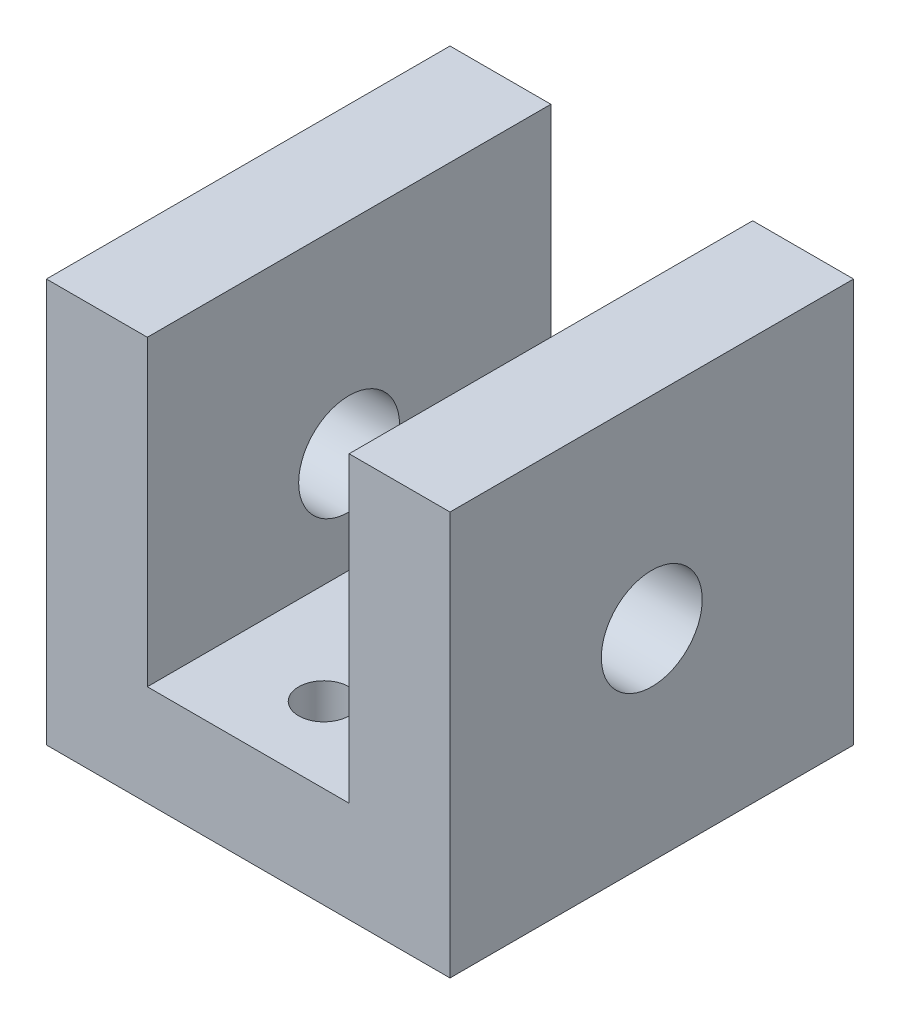
ISO-10303-21;
HEADER;
FILE_DESCRIPTION(('STEP AP214'),'2;1');
FILE_NAME('part.step','',(''),(''),'','','');
FILE_SCHEMA(('AUTOMOTIVE_DESIGN { 1 0 10303 214 1 1 1 1 }'));
ENDSEC;
DATA;
#1=APPLICATION_CONTEXT('core data for automotive mechanical design processes');
#2=APPLICATION_PROTOCOL_DEFINITION('international standard','automotive_design',2000,#1);
#3=PRODUCT_CONTEXT('',#1,'mechanical');
#4=PRODUCT('Part','Part','',(#3));
#5=PRODUCT_RELATED_PRODUCT_CATEGORY('part','',(#4));
#6=PRODUCT_DEFINITION_FORMATION('','',#4);
#7=PRODUCT_DEFINITION_CONTEXT('part definition',#1,'design');
#8=PRODUCT_DEFINITION('design','',#6,#7);
#9=PRODUCT_DEFINITION_SHAPE('','',#8);
#10=(LENGTH_UNIT() NAMED_UNIT(*) SI_UNIT(.MILLI.,.METRE.));
#11=(NAMED_UNIT(*) PLANE_ANGLE_UNIT() SI_UNIT($,.RADIAN.));
#12=(NAMED_UNIT(*) SI_UNIT($,.STERADIAN.) SOLID_ANGLE_UNIT());
#13=UNCERTAINTY_MEASURE_WITH_UNIT(LENGTH_MEASURE(1.E-05),#10,'distance_accuracy_value','');
#14=(GEOMETRIC_REPRESENTATION_CONTEXT(3) GLOBAL_UNCERTAINTY_ASSIGNED_CONTEXT((#13)) GLOBAL_UNIT_ASSIGNED_CONTEXT((#10,
#11,#12)) REPRESENTATION_CONTEXT('',''));
#15=CARTESIAN_POINT('',(0.,0.,0.));
#16=DIRECTION('',(0.,0.,1.));
#17=DIRECTION('',(1.,0.,0.));
#18=AXIS2_PLACEMENT_3D('',#15,#16,#17);
#19=CARTESIAN_POINT('',(50.8,0.,50.8));
#20=DIRECTION('',(0.,1.,0.));
#21=DIRECTION('',(-1.,0.,0.));
#22=AXIS2_PLACEMENT_3D('',#19,#20,#21);
#23=PLANE('',#22);
#24=CARTESIAN_POINT('',(25.4,0.,9.525));
#25=DIRECTION('',(0.,-1.,0.));
#26=DIRECTION('',(1.,0.,0.));
#27=AXIS2_PLACEMENT_3D('',#24,#25,#26);
#28=CIRCLE('',#27,3.175);
#29=CARTESIAN_POINT('',(28.575,0.,9.525));
#30=VERTEX_POINT('',#29);
#31=EDGE_CURVE('E166',#30,#30,#28,.T.);
#32=ORIENTED_EDGE('',*,*,#31,.F.);
#33=EDGE_LOOP('',(#32));
#34=FACE_BOUND('',#33,.T.);
#35=CARTESIAN_POINT('',(25.4,0.,41.275));
#36=DIRECTION('',(0.,-1.,0.));
#37=DIRECTION('',(1.,0.,0.));
#38=AXIS2_PLACEMENT_3D('',#35,#36,#37);
#39=CIRCLE('',#38,3.175);
#40=CARTESIAN_POINT('',(28.575,0.,41.275));
#41=VERTEX_POINT('',#40);
#42=EDGE_CURVE('E158',#41,#41,#39,.T.);
#43=ORIENTED_EDGE('',*,*,#42,.F.);
#44=EDGE_LOOP('',(#43));
#45=FACE_BOUND('',#44,.T.);
#46=DIRECTION('',(1.,0.,0.));
#47=VECTOR('',#46,1.);
#48=CARTESIAN_POINT('',(50.8,0.,0.));
#49=LINE('',#48,#47);
#50=CARTESIAN_POINT('',(0.,0.,0.));
#51=VERTEX_POINT('',#50);
#52=CARTESIAN_POINT('',(50.8,0.,0.));
#53=VERTEX_POINT('',#52);
#54=EDGE_CURVE('E131',#51,#53,#49,.T.);
#55=ORIENTED_EDGE('',*,*,#54,.T.);
#56=DIRECTION('',(0.,0.,-1.));
#57=VECTOR('',#56,1.);
#58=CARTESIAN_POINT('',(50.8,0.,50.8));
#59=LINE('',#58,#57);
#60=CARTESIAN_POINT('',(50.8,0.,50.8));
#61=VERTEX_POINT('',#60);
#62=EDGE_CURVE('E11',#61,#53,#59,.T.);
#63=ORIENTED_EDGE('',*,*,#62,.F.);
#64=DIRECTION('',(1.,0.,0.));
#65=VECTOR('',#64,1.);
#66=CARTESIAN_POINT('',(50.8,0.,50.8));
#67=LINE('',#66,#65);
#68=CARTESIAN_POINT('',(0.,0.,50.8));
#69=VERTEX_POINT('',#68);
#70=EDGE_CURVE('E146',#69,#61,#67,.T.);
#71=ORIENTED_EDGE('',*,*,#70,.F.);
#72=DIRECTION('',(0.,0.,-1.));
#73=VECTOR('',#72,1.);
#74=CARTESIAN_POINT('',(0.,0.,50.8));
#75=LINE('',#74,#73);
#76=EDGE_CURVE('E127',#69,#51,#75,.T.);
#77=ORIENTED_EDGE('',*,*,#76,.T.);
#78=EDGE_LOOP('',(#55,#63,#71,#77));
#79=FACE_BOUND('',#78,.T.);
#80=ADVANCED_FACE('F33',(#34,#45,#79),#23,.F.);
#81=CARTESIAN_POINT('',(50.8,50.8,50.8));
#82=DIRECTION('',(-1.,0.,0.));
#83=DIRECTION('',(0.,-1.,0.));
#84=AXIS2_PLACEMENT_3D('',#81,#82,#83);
#85=PLANE('',#84);
#86=CARTESIAN_POINT('',(50.8,25.4,25.4));
#87=DIRECTION('',(1.,0.,0.));
#88=DIRECTION('',(0.,1.,0.));
#89=AXIS2_PLACEMENT_3D('',#86,#87,#88);
#90=CIRCLE('',#89,6.35);
#91=CARTESIAN_POINT('',(50.8,31.75,25.4));
#92=VERTEX_POINT('',#91);
#93=EDGE_CURVE('E225',#92,#92,#90,.T.);
#94=ORIENTED_EDGE('',*,*,#93,.F.);
#95=EDGE_LOOP('',(#94));
#96=FACE_BOUND('',#95,.T.);
#97=DIRECTION('',(0.,1.,0.));
#98=VECTOR('',#97,1.);
#99=CARTESIAN_POINT('',(50.8,50.8,0.));
#100=LINE('',#99,#98);
#101=CARTESIAN_POINT('',(50.8,50.8,0.));
#102=VERTEX_POINT('',#101);
#103=EDGE_CURVE('E134',#53,#102,#100,.T.);
#104=ORIENTED_EDGE('',*,*,#103,.T.);
#105=DIRECTION('',(0.,0.,-1.));
#106=VECTOR('',#105,1.);
#107=CARTESIAN_POINT('',(50.8,50.8,50.8));
#108=LINE('',#107,#106);
#109=CARTESIAN_POINT('',(50.8,50.8,50.8));
#110=VERTEX_POINT('',#109);
#111=EDGE_CURVE('E42',#110,#102,#108,.T.);
#112=ORIENTED_EDGE('',*,*,#111,.F.);
#113=DIRECTION('',(0.,1.,0.));
#114=VECTOR('',#113,1.);
#115=CARTESIAN_POINT('',(50.8,50.8,50.8));
#116=LINE('',#115,#114);
#117=EDGE_CURVE('E94',#61,#110,#116,.T.);
#118=ORIENTED_EDGE('',*,*,#117,.F.);
#119=ORIENTED_EDGE('',*,*,#62,.T.);
#120=EDGE_LOOP('',(#104,#112,#118,#119));
#121=FACE_BOUND('',#120,.T.);
#122=ADVANCED_FACE('F205',(#96,#121),#85,.F.);
#123=CARTESIAN_POINT('',(38.1,50.8,50.8));
#124=DIRECTION('',(0.,-1.,0.));
#125=DIRECTION('',(0.,0.,-1.));
#126=AXIS2_PLACEMENT_3D('',#123,#124,#125);
#127=PLANE('',#126);
#128=DIRECTION('',(-1.,0.,0.));
#129=VECTOR('',#128,1.);
#130=CARTESIAN_POINT('',(38.1,50.8,0.));
#131=LINE('',#130,#129);
#132=CARTESIAN_POINT('',(38.1,50.8,0.));
#133=VERTEX_POINT('',#132);
#134=EDGE_CURVE('E137',#102,#133,#131,.T.);
#135=ORIENTED_EDGE('',*,*,#134,.T.);
#136=DIRECTION('',(0.,0.,-1.));
#137=VECTOR('',#136,1.);
#138=CARTESIAN_POINT('',(38.1,50.8,50.8));
#139=LINE('',#138,#137);
#140=CARTESIAN_POINT('',(38.1,50.8,50.8));
#141=VERTEX_POINT('',#140);
#142=EDGE_CURVE('E153',#141,#133,#139,.T.);
#143=ORIENTED_EDGE('',*,*,#142,.F.);
#144=DIRECTION('',(-1.,0.,0.));
#145=VECTOR('',#144,1.);
#146=CARTESIAN_POINT('',(38.1,50.8,50.8));
#147=LINE('',#146,#145);
#148=EDGE_CURVE('E172',#110,#141,#147,.T.);
#149=ORIENTED_EDGE('',*,*,#148,.F.);
#150=ORIENTED_EDGE('',*,*,#111,.T.);
#151=EDGE_LOOP('',(#135,#143,#149,#150));
#152=FACE_BOUND('',#151,.T.);
#153=ADVANCED_FACE('F210',(#152),#127,.F.);
#154=CARTESIAN_POINT('',(38.1,12.7,50.8));
#155=DIRECTION('',(1.,0.,0.));
#156=DIRECTION('',(0.,0.,-1.));
#157=AXIS2_PLACEMENT_3D('',#154,#155,#156);
#158=PLANE('',#157);
#159=CARTESIAN_POINT('',(38.1,25.4,25.4));
#160=DIRECTION('',(1.,0.,0.));
#161=DIRECTION('',(0.,0.,-1.));
#162=AXIS2_PLACEMENT_3D('',#159,#160,#161);
#163=CIRCLE('',#162,6.35);
#164=CARTESIAN_POINT('',(38.1,25.4,19.05));
#165=VERTEX_POINT('',#164);
#166=EDGE_CURVE('E216',#165,#165,#163,.T.);
#167=ORIENTED_EDGE('',*,*,#166,.T.);
#168=EDGE_LOOP('',(#167));
#169=FACE_BOUND('',#168,.T.);
#170=DIRECTION('',(0.,-1.,0.));
#171=VECTOR('',#170,1.);
#172=CARTESIAN_POINT('',(38.1,12.7,0.));
#173=LINE('',#172,#171);
#174=CARTESIAN_POINT('',(38.1,12.7,0.));
#175=VERTEX_POINT('',#174);
#176=EDGE_CURVE('E139',#133,#175,#173,.T.);
#177=ORIENTED_EDGE('',*,*,#176,.T.);
#178=DIRECTION('',(0.,0.,-1.));
#179=VECTOR('',#178,1.);
#180=CARTESIAN_POINT('',(38.1,12.7,50.8));
#181=LINE('',#180,#179);
#182=CARTESIAN_POINT('',(38.1,12.7,50.8));
#183=VERTEX_POINT('',#182);
#184=EDGE_CURVE('E150',#183,#175,#181,.T.);
#185=ORIENTED_EDGE('',*,*,#184,.F.);
#186=DIRECTION('',(0.,-1.,0.));
#187=VECTOR('',#186,1.);
#188=CARTESIAN_POINT('',(38.1,12.7,50.8));
#189=LINE('',#188,#187);
#190=EDGE_CURVE('E174',#141,#183,#189,.T.);
#191=ORIENTED_EDGE('',*,*,#190,.F.);
#192=ORIENTED_EDGE('',*,*,#142,.T.);
#193=EDGE_LOOP('',(#177,#185,#191,#192));
#194=FACE_BOUND('',#193,.T.);
#195=ADVANCED_FACE('F180',(#169,#194),#158,.F.);
#196=CARTESIAN_POINT('',(12.7,12.7,50.8));
#197=DIRECTION('',(0.,-1.,0.));
#198=DIRECTION('',(1.,0.,0.));
#199=AXIS2_PLACEMENT_3D('',#196,#197,#198);
#200=PLANE('',#199);
#201=CARTESIAN_POINT('',(25.4,12.7,9.525));
#202=DIRECTION('',(0.,-1.,0.));
#203=DIRECTION('',(1.,0.,0.));
#204=AXIS2_PLACEMENT_3D('',#201,#202,#203);
#205=CIRCLE('',#204,3.175);
#206=CARTESIAN_POINT('',(28.575,12.7,9.525));
#207=VERTEX_POINT('',#206);
#208=EDGE_CURVE('E36',#207,#207,#205,.T.);
#209=ORIENTED_EDGE('',*,*,#208,.T.);
#210=EDGE_LOOP('',(#209));
#211=FACE_BOUND('',#210,.T.);
#212=CARTESIAN_POINT('',(25.4,12.7,41.275));
#213=DIRECTION('',(0.,-1.,0.));
#214=DIRECTION('',(1.,0.,0.));
#215=AXIS2_PLACEMENT_3D('',#212,#213,#214);
#216=CIRCLE('',#215,3.175);
#217=CARTESIAN_POINT('',(28.575,12.7,41.275));
#218=VERTEX_POINT('',#217);
#219=EDGE_CURVE('E135',#218,#218,#216,.T.);
#220=ORIENTED_EDGE('',*,*,#219,.T.);
#221=EDGE_LOOP('',(#220));
#222=FACE_BOUND('',#221,.T.);
#223=DIRECTION('',(-1.,0.,0.));
#224=VECTOR('',#223,1.);
#225=CARTESIAN_POINT('',(12.7,12.7,0.));
#226=LINE('',#225,#224);
#227=CARTESIAN_POINT('',(12.7,12.7,0.));
#228=VERTEX_POINT('',#227);
#229=EDGE_CURVE('E141',#175,#228,#226,.T.);
#230=ORIENTED_EDGE('',*,*,#229,.T.);
#231=DIRECTION('',(0.,0.,-1.));
#232=VECTOR('',#231,1.);
#233=CARTESIAN_POINT('',(12.7,12.7,50.8));
#234=LINE('',#233,#232);
#235=CARTESIAN_POINT('',(12.7,12.7,50.8));
#236=VERTEX_POINT('',#235);
#237=EDGE_CURVE('E122',#236,#228,#234,.T.);
#238=ORIENTED_EDGE('',*,*,#237,.F.);
#239=DIRECTION('',(-1.,0.,0.));
#240=VECTOR('',#239,1.);
#241=CARTESIAN_POINT('',(12.7,12.7,50.8));
#242=LINE('',#241,#240);
#243=EDGE_CURVE('E113',#183,#236,#242,.T.);
#244=ORIENTED_EDGE('',*,*,#243,.F.);
#245=ORIENTED_EDGE('',*,*,#184,.T.);
#246=EDGE_LOOP('',(#230,#238,#244,#245));
#247=FACE_BOUND('',#246,.T.);
#248=ADVANCED_FACE('F184',(#211,#222,#247),#200,.F.);
#249=CARTESIAN_POINT('',(12.7,50.8,50.8));
#250=DIRECTION('',(-1.,0.,0.));
#251=DIRECTION('',(0.,-1.,0.));
#252=AXIS2_PLACEMENT_3D('',#249,#250,#251);
#253=PLANE('',#252);
#254=CARTESIAN_POINT('',(12.7,25.4,25.4));
#255=DIRECTION('',(-1.,0.,0.));
#256=DIRECTION('',(0.,-1.,0.));
#257=AXIS2_PLACEMENT_3D('',#254,#255,#256);
#258=CIRCLE('',#257,6.35);
#259=CARTESIAN_POINT('',(12.7,19.05,25.4));
#260=VERTEX_POINT('',#259);
#261=EDGE_CURVE('E218',#260,#260,#258,.T.);
#262=ORIENTED_EDGE('',*,*,#261,.T.);
#263=EDGE_LOOP('',(#262));
#264=FACE_BOUND('',#263,.T.);
#265=DIRECTION('',(0.,1.,0.));
#266=VECTOR('',#265,1.);
#267=CARTESIAN_POINT('',(12.7,50.8,0.));
#268=LINE('',#267,#266);
#269=CARTESIAN_POINT('',(12.7,50.8,0.));
#270=VERTEX_POINT('',#269);
#271=EDGE_CURVE('E121',#228,#270,#268,.T.);
#272=ORIENTED_EDGE('',*,*,#271,.T.);
#273=DIRECTION('',(0.,0.,-1.));
#274=VECTOR('',#273,1.);
#275=CARTESIAN_POINT('',(12.7,50.8,50.8));
#276=LINE('',#275,#274);
#277=CARTESIAN_POINT('',(12.7,50.8,50.8));
#278=VERTEX_POINT('',#277);
#279=EDGE_CURVE('E118',#278,#270,#276,.T.);
#280=ORIENTED_EDGE('',*,*,#279,.F.);
#281=DIRECTION('',(0.,1.,0.));
#282=VECTOR('',#281,1.);
#283=CARTESIAN_POINT('',(12.7,50.8,50.8));
#284=LINE('',#283,#282);
#285=EDGE_CURVE('E107',#236,#278,#284,.T.);
#286=ORIENTED_EDGE('',*,*,#285,.F.);
#287=ORIENTED_EDGE('',*,*,#237,.T.);
#288=EDGE_LOOP('',(#272,#280,#286,#287));
#289=FACE_BOUND('',#288,.T.);
#290=ADVANCED_FACE('F119',(#264,#289),#253,.F.);
#291=CARTESIAN_POINT('',(0.,50.8,50.8));
#292=DIRECTION('',(0.,-1.,0.));
#293=DIRECTION('',(0.,0.,-1.));
#294=AXIS2_PLACEMENT_3D('',#291,#292,#293);
#295=PLANE('',#294);
#296=DIRECTION('',(-1.,0.,0.));
#297=VECTOR('',#296,1.);
#298=CARTESIAN_POINT('',(0.,50.8,0.));
#299=LINE('',#298,#297);
#300=CARTESIAN_POINT('',(0.,50.8,0.));
#301=VERTEX_POINT('',#300);
#302=EDGE_CURVE('E80',#270,#301,#299,.T.);
#303=ORIENTED_EDGE('',*,*,#302,.T.);
#304=DIRECTION('',(0.,0.,-1.));
#305=VECTOR('',#304,1.);
#306=CARTESIAN_POINT('',(0.,50.8,50.8));
#307=LINE('',#306,#305);
#308=CARTESIAN_POINT('',(0.,50.8,50.8));
#309=VERTEX_POINT('',#308);
#310=EDGE_CURVE('E123',#309,#301,#307,.T.);
#311=ORIENTED_EDGE('',*,*,#310,.F.);
#312=DIRECTION('',(-1.,0.,0.));
#313=VECTOR('',#312,1.);
#314=CARTESIAN_POINT('',(0.,50.8,50.8));
#315=LINE('',#314,#313);
#316=EDGE_CURVE('E111',#278,#309,#315,.T.);
#317=ORIENTED_EDGE('',*,*,#316,.F.);
#318=ORIENTED_EDGE('',*,*,#279,.T.);
#319=EDGE_LOOP('',(#303,#311,#317,#318));
#320=FACE_BOUND('',#319,.T.);
#321=ADVANCED_FACE('F125',(#320),#295,.F.);
#322=CARTESIAN_POINT('',(0.,0.,50.8));
#323=DIRECTION('',(1.,0.,0.));
#324=DIRECTION('',(0.,0.,-1.));
#325=AXIS2_PLACEMENT_3D('',#322,#323,#324);
#326=PLANE('',#325);
#327=CARTESIAN_POINT('',(0.,25.4,25.4));
#328=DIRECTION('',(1.,0.,0.));
#329=DIRECTION('',(0.,1.,0.));
#330=AXIS2_PLACEMENT_3D('',#327,#328,#329);
#331=CIRCLE('',#330,6.35);
#332=CARTESIAN_POINT('',(0.,31.75,25.4));
#333=VERTEX_POINT('',#332);
#334=EDGE_CURVE('E222',#333,#333,#331,.T.);
#335=ORIENTED_EDGE('',*,*,#334,.T.);
#336=EDGE_LOOP('',(#335));
#337=FACE_BOUND('',#336,.T.);
#338=DIRECTION('',(0.,-1.,0.));
#339=VECTOR('',#338,1.);
#340=CARTESIAN_POINT('',(0.,0.,0.));
#341=LINE('',#340,#339);
#342=EDGE_CURVE('E86',#301,#51,#341,.T.);
#343=ORIENTED_EDGE('',*,*,#342,.T.);
#344=ORIENTED_EDGE('',*,*,#76,.F.);
#345=DIRECTION('',(0.,-1.,0.));
#346=VECTOR('',#345,1.);
#347=CARTESIAN_POINT('',(0.,0.,50.8));
#348=LINE('',#347,#346);
#349=EDGE_CURVE('E51',#309,#69,#348,.T.);
#350=ORIENTED_EDGE('',*,*,#349,.F.);
#351=ORIENTED_EDGE('',*,*,#310,.T.);
#352=EDGE_LOOP('',(#343,#344,#350,#351));
#353=FACE_BOUND('',#352,.T.);
#354=ADVANCED_FACE('F192',(#337,#353),#326,.F.);
#355=CARTESIAN_POINT('',(0.,0.,50.8));
#356=DIRECTION('',(0.,0.,-1.));
#357=DIRECTION('',(-1.,0.,0.));
#358=AXIS2_PLACEMENT_3D('',#355,#356,#357);
#359=PLANE('',#358);
#360=ORIENTED_EDGE('',*,*,#70,.T.);
#361=ORIENTED_EDGE('',*,*,#117,.T.);
#362=ORIENTED_EDGE('',*,*,#148,.T.);
#363=ORIENTED_EDGE('',*,*,#190,.T.);
#364=ORIENTED_EDGE('',*,*,#243,.T.);
#365=ORIENTED_EDGE('',*,*,#285,.T.);
#366=ORIENTED_EDGE('',*,*,#316,.T.);
#367=ORIENTED_EDGE('',*,*,#349,.T.);
#368=EDGE_LOOP('',(#360,#361,#362,#363,#364,#365,#366,#367));
#369=FACE_BOUND('',#368,.T.);
#370=ADVANCED_FACE('F109',(#369),#359,.F.);
#371=CARTESIAN_POINT('',(0.,0.,0.));
#372=DIRECTION('',(0.,0.,-1.));
#373=DIRECTION('',(-1.,0.,0.));
#374=AXIS2_PLACEMENT_3D('',#371,#372,#373);
#375=PLANE('',#374);
#376=ORIENTED_EDGE('',*,*,#54,.F.);
#377=ORIENTED_EDGE('',*,*,#342,.F.);
#378=ORIENTED_EDGE('',*,*,#302,.F.);
#379=ORIENTED_EDGE('',*,*,#271,.F.);
#380=ORIENTED_EDGE('',*,*,#229,.F.);
#381=ORIENTED_EDGE('',*,*,#176,.F.);
#382=ORIENTED_EDGE('',*,*,#134,.F.);
#383=ORIENTED_EDGE('',*,*,#103,.F.);
#384=EDGE_LOOP('',(#376,#377,#378,#379,#380,#381,#382,#383));
#385=FACE_BOUND('',#384,.T.);
#386=ADVANCED_FACE('F187',(#385),#375,.T.);
#387=CARTESIAN_POINT('',(25.4,50.8,41.275));
#388=DIRECTION('',(0.,-1.,0.));
#389=DIRECTION('',(1.,0.,0.));
#390=AXIS2_PLACEMENT_3D('',#387,#388,#389);
#391=CYLINDRICAL_SURFACE('',#390,3.175);
#392=ORIENTED_EDGE('',*,*,#42,.T.);
#393=EDGE_LOOP('',(#392));
#394=FACE_BOUND('',#393,.T.);
#395=ORIENTED_EDGE('',*,*,#219,.F.);
#396=EDGE_LOOP('',(#395));
#397=FACE_BOUND('',#396,.T.);
#398=ADVANCED_FACE('F272',(#394,#397),#391,.F.);
#399=CARTESIAN_POINT('',(25.4,50.8,9.525));
#400=DIRECTION('',(0.,-1.,0.));
#401=DIRECTION('',(1.,0.,0.));
#402=AXIS2_PLACEMENT_3D('',#399,#400,#401);
#403=CYLINDRICAL_SURFACE('',#402,3.175);
#404=ORIENTED_EDGE('',*,*,#31,.T.);
#405=EDGE_LOOP('',(#404));
#406=FACE_BOUND('',#405,.T.);
#407=ORIENTED_EDGE('',*,*,#208,.F.);
#408=EDGE_LOOP('',(#407));
#409=FACE_BOUND('',#408,.T.);
#410=ADVANCED_FACE('F234',(#406,#409),#403,.F.);
#411=CARTESIAN_POINT('',(0.,25.4,25.4));
#412=DIRECTION('',(1.,0.,0.));
#413=DIRECTION('',(0.,1.,0.));
#414=AXIS2_PLACEMENT_3D('',#411,#412,#413);
#415=CYLINDRICAL_SURFACE('',#414,6.35);
#416=ORIENTED_EDGE('',*,*,#334,.F.);
#417=EDGE_LOOP('',(#416));
#418=FACE_BOUND('',#417,.T.);
#419=ORIENTED_EDGE('',*,*,#261,.F.);
#420=EDGE_LOOP('',(#419));
#421=FACE_BOUND('',#420,.T.);
#422=ADVANCED_FACE('F230',(#418,#421),#415,.F.);
#423=ORIENTED_EDGE('',*,*,#93,.T.);
#424=EDGE_LOOP('',(#423));
#425=FACE_BOUND('',#424,.T.);
#426=ORIENTED_EDGE('',*,*,#166,.F.);
#427=EDGE_LOOP('',(#426));
#428=FACE_BOUND('',#427,.T.);
#429=ADVANCED_FACE('F233',(#425,#428),#415,.F.);
#430=CLOSED_SHELL('',(#80,#122,#153,#195,#248,#290,#321,#354,#370,#386,#398,#410,#422,#429));
#431=MANIFOLD_SOLID_BREP('B2',#430);
#432=ADVANCED_BREP_SHAPE_REPRESENTATION('',(#18,#431),#14);
#433=SHAPE_DEFINITION_REPRESENTATION(#9,#432);
ENDSEC;
END-ISO-10303-21;
